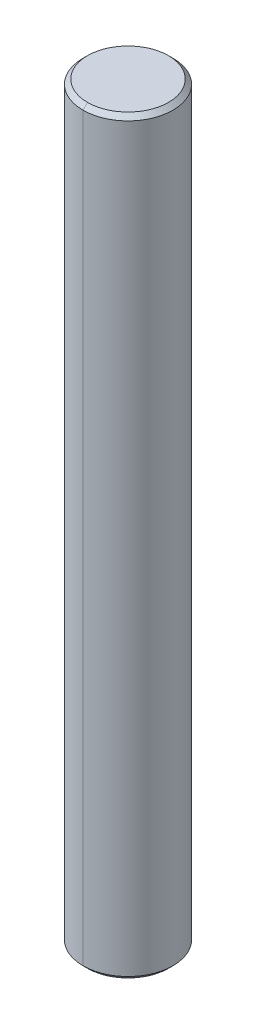
ISO-10303-21;
HEADER;
FILE_DESCRIPTION(('STEP AP214'),'2;1');
FILE_NAME('part.step','',(''),(''),'','','');
FILE_SCHEMA(('AUTOMOTIVE_DESIGN { 1 0 10303 214 1 1 1 1 }'));
ENDSEC;
DATA;
#1=APPLICATION_CONTEXT('core data for automotive mechanical design processes');
#2=APPLICATION_PROTOCOL_DEFINITION('international standard','automotive_design',2000,#1);
#3=PRODUCT_CONTEXT('',#1,'mechanical');
#4=PRODUCT('Part','Part','',(#3));
#5=PRODUCT_RELATED_PRODUCT_CATEGORY('part','',(#4));
#6=PRODUCT_DEFINITION_FORMATION('','',#4);
#7=PRODUCT_DEFINITION_CONTEXT('part definition',#1,'design');
#8=PRODUCT_DEFINITION('design','',#6,#7);
#9=PRODUCT_DEFINITION_SHAPE('','',#8);
#10=(LENGTH_UNIT() NAMED_UNIT(*) SI_UNIT(.MILLI.,.METRE.));
#11=(NAMED_UNIT(*) PLANE_ANGLE_UNIT() SI_UNIT($,.RADIAN.));
#12=(NAMED_UNIT(*) SI_UNIT($,.STERADIAN.) SOLID_ANGLE_UNIT());
#13=UNCERTAINTY_MEASURE_WITH_UNIT(LENGTH_MEASURE(1.E-05),#10,'distance_accuracy_value','');
#14=(GEOMETRIC_REPRESENTATION_CONTEXT(3) GLOBAL_UNCERTAINTY_ASSIGNED_CONTEXT((#13)) GLOBAL_UNIT_ASSIGNED_CONTEXT((#10,
#11,#12)) REPRESENTATION_CONTEXT('',''));
#15=CARTESIAN_POINT('',(0.,0.,0.));
#16=DIRECTION('',(0.,0.,1.));
#17=DIRECTION('',(1.,0.,0.));
#18=AXIS2_PLACEMENT_3D('',#15,#16,#17);
#19=CARTESIAN_POINT('',(0.,-24.7,0.));
#20=DIRECTION('',(0.,1.,0.));
#21=DIRECTION('',(-1.,0.,0.));
#22=AXIS2_PLACEMENT_3D('',#19,#20,#21);
#23=CONICAL_SURFACE('',#22,3.,0.7853981634);
#24=CARTESIAN_POINT('',(0.,-25.,0.));
#25=DIRECTION('',(0.,-1.,0.));
#26=DIRECTION('',(0.,0.,-1.));
#27=AXIS2_PLACEMENT_3D('',#24,#25,#26);
#28=CIRCLE('',#27,2.7);
#29=CARTESIAN_POINT('',(0.,-25.,-2.7));
#30=VERTEX_POINT('',#29);
#31=CARTESIAN_POINT('',(0.,-24.9999999999992,2.69999999999923));
#32=VERTEX_POINT('',#31);
#33=EDGE_CURVE('E11',#30,#32,#28,.T.);
#34=ORIENTED_EDGE('',*,*,#33,.F.);
#35=DIRECTION('',(0.,0.707106781184737,-0.707106781188358));
#36=VECTOR('',#35,1.);
#37=CARTESIAN_POINT('',(0.,-24.9999999999992,-2.69999999999923));
#38=LINE('',#37,#36);
#39=CARTESIAN_POINT('',(0.,-24.7,-3.));
#40=VERTEX_POINT('',#39);
#41=EDGE_CURVE('E24',#30,#40,#38,.T.);
#42=ORIENTED_EDGE('',*,*,#41,.T.);
#43=CARTESIAN_POINT('',(0.,-24.7,0.));
#44=DIRECTION('',(0.,-1.,0.));
#45=DIRECTION('',(0.,0.,-1.));
#46=AXIS2_PLACEMENT_3D('',#43,#44,#45);
#47=CIRCLE('',#46,3.);
#48=CARTESIAN_POINT('',(0.,-24.7,3.));
#49=VERTEX_POINT('',#48);
#50=EDGE_CURVE('E110',#40,#49,#47,.T.);
#51=ORIENTED_EDGE('',*,*,#50,.T.);
#52=DIRECTION('',(0.,0.707106781184737,0.707106781188358));
#53=VECTOR('',#52,1.);
#54=CARTESIAN_POINT('',(0.,-24.9999999999992,2.69999999999923));
#55=LINE('',#54,#53);
#56=EDGE_CURVE('E105',#32,#49,#55,.T.);
#57=ORIENTED_EDGE('',*,*,#56,.F.);
#58=EDGE_LOOP('',(#34,#42,#51,#57));
#59=FACE_BOUND('',#58,.T.);
#60=ADVANCED_FACE('F16',(#59),#23,.T.);
#61=CARTESIAN_POINT('',(0.,-24.7,0.));
#62=DIRECTION('',(0.,1.,0.));
#63=DIRECTION('',(1.,0.,0.));
#64=AXIS2_PLACEMENT_3D('',#61,#62,#63);
#65=CONICAL_SURFACE('',#64,3.,0.7853981634);
#66=CARTESIAN_POINT('',(0.,-24.7,0.));
#67=DIRECTION('',(0.,-1.,0.));
#68=DIRECTION('',(0.,0.,-1.));
#69=AXIS2_PLACEMENT_3D('',#66,#67,#68);
#70=CIRCLE('',#69,3.);
#71=EDGE_CURVE('E101',#49,#40,#70,.T.);
#72=ORIENTED_EDGE('',*,*,#71,.T.);
#73=ORIENTED_EDGE('',*,*,#41,.F.);
#74=CARTESIAN_POINT('',(0.,-25.,0.));
#75=DIRECTION('',(0.,-1.,0.));
#76=DIRECTION('',(0.,0.,-1.));
#77=AXIS2_PLACEMENT_3D('',#74,#75,#76);
#78=CIRCLE('',#77,2.7);
#79=EDGE_CURVE('E96',#32,#30,#78,.T.);
#80=ORIENTED_EDGE('',*,*,#79,.F.);
#81=ORIENTED_EDGE('',*,*,#56,.T.);
#82=EDGE_LOOP('',(#72,#73,#80,#81));
#83=FACE_BOUND('',#82,.T.);
#84=ADVANCED_FACE('F124',(#83),#65,.T.);
#85=CARTESIAN_POINT('',(2.7,-25.,0.));
#86=DIRECTION('',(0.,1.,0.));
#87=DIRECTION('',(0.,0.,1.));
#88=AXIS2_PLACEMENT_3D('',#85,#86,#87);
#89=PLANE('',#88);
#90=ORIENTED_EDGE('',*,*,#33,.T.);
#91=ORIENTED_EDGE('',*,*,#79,.T.);
#92=EDGE_LOOP('',(#90,#91));
#93=FACE_BOUND('',#92,.T.);
#94=ADVANCED_FACE('F137',(#93),#89,.F.);
#95=CARTESIAN_POINT('',(0.,-25.,0.));
#96=DIRECTION('',(0.,1.,0.));
#97=DIRECTION('',(1.,0.,0.));
#98=AXIS2_PLACEMENT_3D('',#95,#96,#97);
#99=CYLINDRICAL_SURFACE('',#98,3.);
#100=CARTESIAN_POINT('',(0.,24.7,0.));
#101=DIRECTION('',(0.,-1.,0.));
#102=DIRECTION('',(0.,0.,-1.));
#103=AXIS2_PLACEMENT_3D('',#100,#101,#102);
#104=CIRCLE('',#103,3.);
#105=CARTESIAN_POINT('',(0.,24.7,3.));
#106=VERTEX_POINT('',#105);
#107=CARTESIAN_POINT('',(0.,24.7,-3.));
#108=VERTEX_POINT('',#107);
#109=EDGE_CURVE('E67',#106,#108,#104,.T.);
#110=ORIENTED_EDGE('',*,*,#109,.T.);
#111=DIRECTION('',(0.,1.,0.));
#112=VECTOR('',#111,1.);
#113=CARTESIAN_POINT('',(0.,-24.7,-3.));
#114=LINE('',#113,#112);
#115=EDGE_CURVE('E88',#40,#108,#114,.T.);
#116=ORIENTED_EDGE('',*,*,#115,.F.);
#117=ORIENTED_EDGE('',*,*,#71,.F.);
#118=DIRECTION('',(0.,1.,0.));
#119=VECTOR('',#118,1.);
#120=CARTESIAN_POINT('',(0.,-24.7,3.));
#121=LINE('',#120,#119);
#122=EDGE_CURVE('E84',#49,#106,#121,.T.);
#123=ORIENTED_EDGE('',*,*,#122,.T.);
#124=EDGE_LOOP('',(#110,#116,#117,#123));
#125=FACE_BOUND('',#124,.T.);
#126=ADVANCED_FACE('F127',(#125),#99,.T.);
#127=CARTESIAN_POINT('',(0.,-25.,0.));
#128=DIRECTION('',(0.,1.,0.));
#129=DIRECTION('',(-1.,0.,0.));
#130=AXIS2_PLACEMENT_3D('',#127,#128,#129);
#131=CYLINDRICAL_SURFACE('',#130,3.);
#132=ORIENTED_EDGE('',*,*,#50,.F.);
#133=ORIENTED_EDGE('',*,*,#115,.T.);
#134=CARTESIAN_POINT('',(0.,24.7,0.));
#135=DIRECTION('',(0.,-1.,0.));
#136=DIRECTION('',(0.,0.,-1.));
#137=AXIS2_PLACEMENT_3D('',#134,#135,#136);
#138=CIRCLE('',#137,3.);
#139=EDGE_CURVE('E79',#108,#106,#138,.T.);
#140=ORIENTED_EDGE('',*,*,#139,.T.);
#141=ORIENTED_EDGE('',*,*,#122,.F.);
#142=EDGE_LOOP('',(#132,#133,#140,#141));
#143=FACE_BOUND('',#142,.T.);
#144=ADVANCED_FACE('F128',(#143),#131,.T.);
#145=CARTESIAN_POINT('',(0.,25.,0.));
#146=DIRECTION('',(0.,-1.,0.));
#147=DIRECTION('',(-1.,0.,0.));
#148=AXIS2_PLACEMENT_3D('',#145,#146,#147);
#149=CONICAL_SURFACE('',#148,2.7,0.7853981634);
#150=ORIENTED_EDGE('',*,*,#139,.F.);
#151=DIRECTION('',(0.,-0.707106781184737,-0.707106781188358));
#152=VECTOR('',#151,1.);
#153=CARTESIAN_POINT('',(0.,25.,-2.7));
#154=LINE('',#153,#152);
#155=CARTESIAN_POINT('',(0.,25.,-2.7));
#156=VERTEX_POINT('',#155);
#157=EDGE_CURVE('E59',#156,#108,#154,.T.);
#158=ORIENTED_EDGE('',*,*,#157,.F.);
#159=CARTESIAN_POINT('',(0.,25.,0.));
#160=DIRECTION('',(0.,-1.,0.));
#161=DIRECTION('',(0.,0.,-1.));
#162=AXIS2_PLACEMENT_3D('',#159,#160,#161);
#163=CIRCLE('',#162,2.7);
#164=CARTESIAN_POINT('',(0.,25.,2.7));
#165=VERTEX_POINT('',#164);
#166=EDGE_CURVE('E52',#156,#165,#163,.T.);
#167=ORIENTED_EDGE('',*,*,#166,.T.);
#168=DIRECTION('',(0.,-0.707106781184737,0.707106781188358));
#169=VECTOR('',#168,1.);
#170=CARTESIAN_POINT('',(0.,25.,2.7));
#171=LINE('',#170,#169);
#172=EDGE_CURVE('E56',#165,#106,#171,.T.);
#173=ORIENTED_EDGE('',*,*,#172,.T.);
#174=EDGE_LOOP('',(#150,#158,#167,#173));
#175=FACE_BOUND('',#174,.T.);
#176=ADVANCED_FACE('F55',(#175),#149,.T.);
#177=CARTESIAN_POINT('',(0.,25.,0.));
#178=DIRECTION('',(0.,-1.,0.));
#179=DIRECTION('',(1.,0.,0.));
#180=AXIS2_PLACEMENT_3D('',#177,#178,#179);
#181=CONICAL_SURFACE('',#180,2.7,0.7853981634);
#182=CARTESIAN_POINT('',(0.,25.,0.));
#183=DIRECTION('',(0.,-1.,0.));
#184=DIRECTION('',(0.,0.,-1.));
#185=AXIS2_PLACEMENT_3D('',#182,#183,#184);
#186=CIRCLE('',#185,2.7);
#187=EDGE_CURVE('E66',#165,#156,#186,.T.);
#188=ORIENTED_EDGE('',*,*,#187,.T.);
#189=ORIENTED_EDGE('',*,*,#157,.T.);
#190=ORIENTED_EDGE('',*,*,#109,.F.);
#191=ORIENTED_EDGE('',*,*,#172,.F.);
#192=EDGE_LOOP('',(#188,#189,#190,#191));
#193=FACE_BOUND('',#192,.T.);
#194=ADVANCED_FACE('F65',(#193),#181,.T.);
#195=CARTESIAN_POINT('',(0.,25.,0.));
#196=DIRECTION('',(0.,-1.,0.));
#197=DIRECTION('',(0.,0.,-1.));
#198=AXIS2_PLACEMENT_3D('',#195,#196,#197);
#199=PLANE('',#198);
#200=ORIENTED_EDGE('',*,*,#166,.F.);
#201=ORIENTED_EDGE('',*,*,#187,.F.);
#202=EDGE_LOOP('',(#200,#201));
#203=FACE_BOUND('',#202,.T.);
#204=ADVANCED_FACE('F69',(#203),#199,.F.);
#205=CLOSED_SHELL('',(#60,#84,#94,#126,#144,#176,#194,#204));
#206=MANIFOLD_SOLID_BREP('B1',#205);
#207=ADVANCED_BREP_SHAPE_REPRESENTATION('',(#18,#206),#14);
#208=SHAPE_DEFINITION_REPRESENTATION(#9,#207);
ENDSEC;
END-ISO-10303-21;
